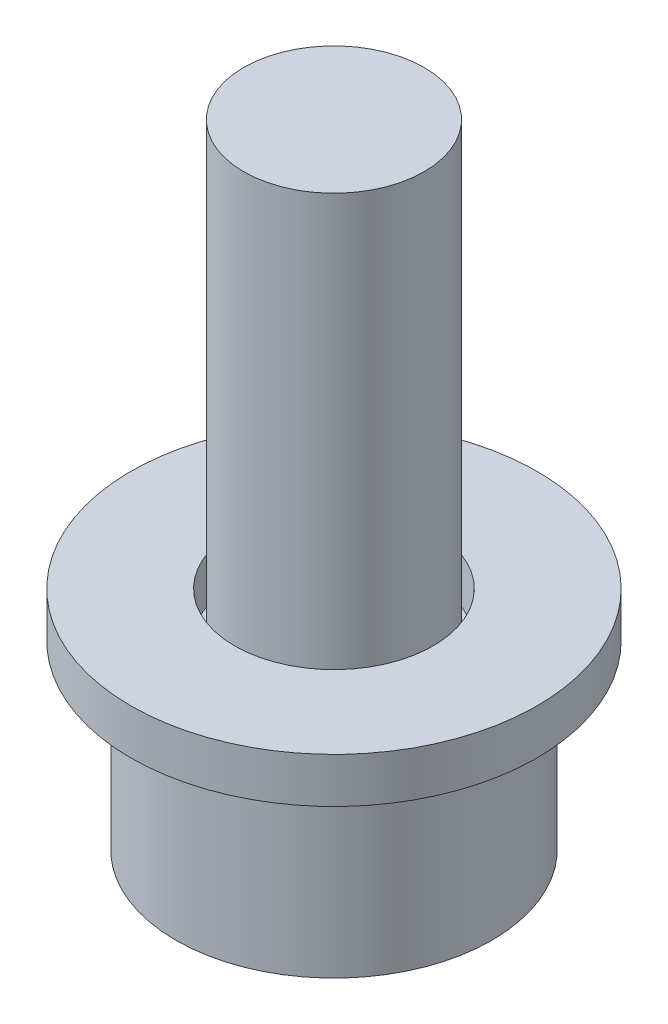
ISO-10303-21;
HEADER;
FILE_DESCRIPTION(('STEP AP214'),'2;1');
FILE_NAME('part.step','',(''),(''),'','','');
FILE_SCHEMA(('AUTOMOTIVE_DESIGN { 1 0 10303 214 1 1 1 1 }'));
ENDSEC;
DATA;
#1=APPLICATION_CONTEXT('core data for automotive mechanical design processes');
#2=APPLICATION_PROTOCOL_DEFINITION('international standard','automotive_design',2000,#1);
#3=PRODUCT_CONTEXT('',#1,'mechanical');
#4=PRODUCT('Part','Part','',(#3));
#5=PRODUCT_RELATED_PRODUCT_CATEGORY('part','',(#4));
#6=PRODUCT_DEFINITION_FORMATION('','',#4);
#7=PRODUCT_DEFINITION_CONTEXT('part definition',#1,'design');
#8=PRODUCT_DEFINITION('design','',#6,#7);
#9=PRODUCT_DEFINITION_SHAPE('','',#8);
#10=(LENGTH_UNIT() NAMED_UNIT(*) SI_UNIT(.MILLI.,.METRE.));
#11=(NAMED_UNIT(*) PLANE_ANGLE_UNIT() SI_UNIT($,.RADIAN.));
#12=(NAMED_UNIT(*) SI_UNIT($,.STERADIAN.) SOLID_ANGLE_UNIT());
#13=UNCERTAINTY_MEASURE_WITH_UNIT(LENGTH_MEASURE(1.E-05),#10,'distance_accuracy_value','');
#14=(GEOMETRIC_REPRESENTATION_CONTEXT(3) GLOBAL_UNCERTAINTY_ASSIGNED_CONTEXT((#13)) GLOBAL_UNIT_ASSIGNED_CONTEXT((#10,
#11,#12)) REPRESENTATION_CONTEXT('',''));
#15=CARTESIAN_POINT('',(0.,0.,0.));
#16=DIRECTION('',(0.,0.,1.));
#17=DIRECTION('',(1.,0.,0.));
#18=AXIS2_PLACEMENT_3D('',#15,#16,#17);
#19=CARTESIAN_POINT('',(0.,17.,0.));
#20=DIRECTION('',(0.,1.,0.));
#21=DIRECTION('',(1.,0.,0.));
#22=AXIS2_PLACEMENT_3D('',#19,#20,#21);
#23=PLANE('',#22);
#24=CARTESIAN_POINT('',(0.,17.,0.));
#25=DIRECTION('',(0.,1.,0.));
#26=DIRECTION('',(0.,0.,1.));
#27=AXIS2_PLACEMENT_3D('',#24,#25,#26);
#28=CIRCLE('',#27,2.);
#29=CARTESIAN_POINT('',(0.,17.,2.));
#30=VERTEX_POINT('',#29);
#31=EDGE_CURVE('E10',#30,#30,#28,.T.);
#32=ORIENTED_EDGE('',*,*,#31,.T.);
#33=EDGE_LOOP('',(#32));
#34=FACE_BOUND('',#33,.T.);
#35=ADVANCED_FACE('F15',(#34),#23,.T.);
#36=CARTESIAN_POINT('',(0.,7.,0.));
#37=DIRECTION('',(0.,1.,0.));
#38=DIRECTION('',(0.,0.,1.));
#39=AXIS2_PLACEMENT_3D('',#36,#37,#38);
#40=CYLINDRICAL_SURFACE('',#39,2.);
#41=ORIENTED_EDGE('',*,*,#31,.F.);
#42=EDGE_LOOP('',(#41));
#43=FACE_BOUND('',#42,.T.);
#44=CARTESIAN_POINT('',(0.,7.,0.));
#45=DIRECTION('',(0.,1.,0.));
#46=DIRECTION('',(0.,0.,1.));
#47=AXIS2_PLACEMENT_3D('',#44,#45,#46);
#48=CIRCLE('',#47,2.);
#49=CARTESIAN_POINT('',(0.,7.,2.));
#50=VERTEX_POINT('',#49);
#51=EDGE_CURVE('E23',#50,#50,#48,.T.);
#52=ORIENTED_EDGE('',*,*,#51,.T.);
#53=EDGE_LOOP('',(#52));
#54=FACE_BOUND('',#53,.T.);
#55=ADVANCED_FACE('F17',(#43,#54),#40,.T.);
#56=CARTESIAN_POINT('',(0.,3.,0.));
#57=DIRECTION('',(0.,1.,0.));
#58=DIRECTION('',(1.,0.,0.));
#59=AXIS2_PLACEMENT_3D('',#56,#57,#58);
#60=PLANE('',#59);
#61=CARTESIAN_POINT('',(0.,3.,0.));
#62=DIRECTION('',(0.,1.,0.));
#63=DIRECTION('',(0.,0.,1.));
#64=AXIS2_PLACEMENT_3D('',#61,#62,#63);
#65=CIRCLE('',#64,3.5);
#66=CARTESIAN_POINT('',(0.,3.,3.5));
#67=VERTEX_POINT('',#66);
#68=EDGE_CURVE('E31',#67,#67,#65,.T.);
#69=ORIENTED_EDGE('',*,*,#68,.F.);
#70=EDGE_LOOP('',(#69));
#71=FACE_BOUND('',#70,.T.);
#72=ADVANCED_FACE('F72',(#71),#60,.F.);
#73=CARTESIAN_POINT('',(0.,7.,0.));
#74=DIRECTION('',(0.,1.,0.));
#75=DIRECTION('',(1.,0.,0.));
#76=AXIS2_PLACEMENT_3D('',#73,#74,#75);
#77=PLANE('',#76);
#78=ORIENTED_EDGE('',*,*,#51,.F.);
#79=EDGE_LOOP('',(#78));
#80=FACE_BOUND('',#79,.T.);
#81=CARTESIAN_POINT('',(0.,7.,0.));
#82=DIRECTION('',(0.,1.,0.));
#83=DIRECTION('',(0.,0.,1.));
#84=AXIS2_PLACEMENT_3D('',#81,#82,#83);
#85=CIRCLE('',#84,2.2);
#86=CARTESIAN_POINT('',(0.,7.,2.2));
#87=VERTEX_POINT('',#86);
#88=EDGE_CURVE('E37',#87,#87,#85,.T.);
#89=ORIENTED_EDGE('',*,*,#88,.T.);
#90=EDGE_LOOP('',(#89));
#91=FACE_BOUND('',#90,.T.);
#92=ADVANCED_FACE('F68',(#80,#91),#77,.T.);
#93=CARTESIAN_POINT('',(0.,3.,0.));
#94=DIRECTION('',(0.,1.,0.));
#95=DIRECTION('',(0.,0.,1.));
#96=AXIS2_PLACEMENT_3D('',#93,#94,#95);
#97=CYLINDRICAL_SURFACE('',#96,3.5);
#98=CARTESIAN_POINT('',(0.,7.,0.));
#99=DIRECTION('',(0.,1.,0.));
#100=DIRECTION('',(0.,0.,1.));
#101=AXIS2_PLACEMENT_3D('',#98,#99,#100);
#102=CIRCLE('',#101,3.5);
#103=CARTESIAN_POINT('',(0.,7.,3.5));
#104=VERTEX_POINT('',#103);
#105=EDGE_CURVE('E43',#104,#104,#102,.T.);
#106=ORIENTED_EDGE('',*,*,#105,.F.);
#107=EDGE_LOOP('',(#106));
#108=FACE_BOUND('',#107,.T.);
#109=ORIENTED_EDGE('',*,*,#68,.T.);
#110=EDGE_LOOP('',(#109));
#111=FACE_BOUND('',#110,.T.);
#112=ADVANCED_FACE('F64',(#108,#111),#97,.T.);
#113=CARTESIAN_POINT('',(0.,6.9,0.));
#114=DIRECTION('',(0.,1.,0.));
#115=DIRECTION('',(0.,0.,1.));
#116=AXIS2_PLACEMENT_3D('',#113,#114,#115);
#117=CYLINDRICAL_SURFACE('',#116,2.2);
#118=CARTESIAN_POINT('',(0.,8.,0.));
#119=DIRECTION('',(0.,1.,0.));
#120=DIRECTION('',(0.,0.,1.));
#121=AXIS2_PLACEMENT_3D('',#118,#119,#120);
#122=CIRCLE('',#121,2.2);
#123=CARTESIAN_POINT('',(0.,8.,2.2));
#124=VERTEX_POINT('',#123);
#125=EDGE_CURVE('E44',#124,#124,#122,.T.);
#126=ORIENTED_EDGE('',*,*,#125,.T.);
#127=EDGE_LOOP('',(#126));
#128=FACE_BOUND('',#127,.T.);
#129=ORIENTED_EDGE('',*,*,#88,.F.);
#130=EDGE_LOOP('',(#129));
#131=FACE_BOUND('',#130,.T.);
#132=ADVANCED_FACE('F67',(#128,#131),#117,.F.);
#133=CARTESIAN_POINT('',(0.,7.,0.));
#134=DIRECTION('',(0.,1.,0.));
#135=DIRECTION('',(1.,0.,0.));
#136=AXIS2_PLACEMENT_3D('',#133,#134,#135);
#137=PLANE('',#136);
#138=ORIENTED_EDGE('',*,*,#105,.T.);
#139=EDGE_LOOP('',(#138));
#140=FACE_BOUND('',#139,.T.);
#141=CARTESIAN_POINT('',(0.,7.,0.));
#142=DIRECTION('',(0.,1.,0.));
#143=DIRECTION('',(0.,0.,1.));
#144=AXIS2_PLACEMENT_3D('',#141,#142,#143);
#145=CIRCLE('',#144,4.5);
#146=CARTESIAN_POINT('',(0.,7.,4.5));
#147=VERTEX_POINT('',#146);
#148=EDGE_CURVE('E48',#147,#147,#145,.T.);
#149=ORIENTED_EDGE('',*,*,#148,.F.);
#150=EDGE_LOOP('',(#149));
#151=FACE_BOUND('',#150,.T.);
#152=ADVANCED_FACE('F61',(#140,#151),#137,.F.);
#153=CARTESIAN_POINT('',(0.,8.,0.));
#154=DIRECTION('',(0.,1.,0.));
#155=DIRECTION('',(1.,0.,0.));
#156=AXIS2_PLACEMENT_3D('',#153,#154,#155);
#157=PLANE('',#156);
#158=ORIENTED_EDGE('',*,*,#125,.F.);
#159=EDGE_LOOP('',(#158));
#160=FACE_BOUND('',#159,.T.);
#161=CARTESIAN_POINT('',(0.,8.,0.));
#162=DIRECTION('',(0.,1.,0.));
#163=DIRECTION('',(0.,0.,1.));
#164=AXIS2_PLACEMENT_3D('',#161,#162,#163);
#165=CIRCLE('',#164,4.5);
#166=CARTESIAN_POINT('',(0.,8.,4.5));
#167=VERTEX_POINT('',#166);
#168=EDGE_CURVE('E52',#167,#167,#165,.T.);
#169=ORIENTED_EDGE('',*,*,#168,.T.);
#170=EDGE_LOOP('',(#169));
#171=FACE_BOUND('',#170,.T.);
#172=ADVANCED_FACE('F92',(#160,#171),#157,.T.);
#173=CARTESIAN_POINT('',(0.,7.,0.));
#174=DIRECTION('',(0.,1.,0.));
#175=DIRECTION('',(0.,0.,1.));
#176=AXIS2_PLACEMENT_3D('',#173,#174,#175);
#177=CYLINDRICAL_SURFACE('',#176,4.5);
#178=ORIENTED_EDGE('',*,*,#168,.F.);
#179=EDGE_LOOP('',(#178));
#180=FACE_BOUND('',#179,.T.);
#181=ORIENTED_EDGE('',*,*,#148,.T.);
#182=EDGE_LOOP('',(#181));
#183=FACE_BOUND('',#182,.T.);
#184=ADVANCED_FACE('F95',(#180,#183),#177,.T.);
#185=CLOSED_SHELL('',(#35,#55,#72,#92,#112,#132,#152,#172,#184));
#186=MANIFOLD_SOLID_BREP('B1',#185);
#187=ADVANCED_BREP_SHAPE_REPRESENTATION('',(#18,#186),#14);
#188=SHAPE_DEFINITION_REPRESENTATION(#9,#187);
ENDSEC;
END-ISO-10303-21;
